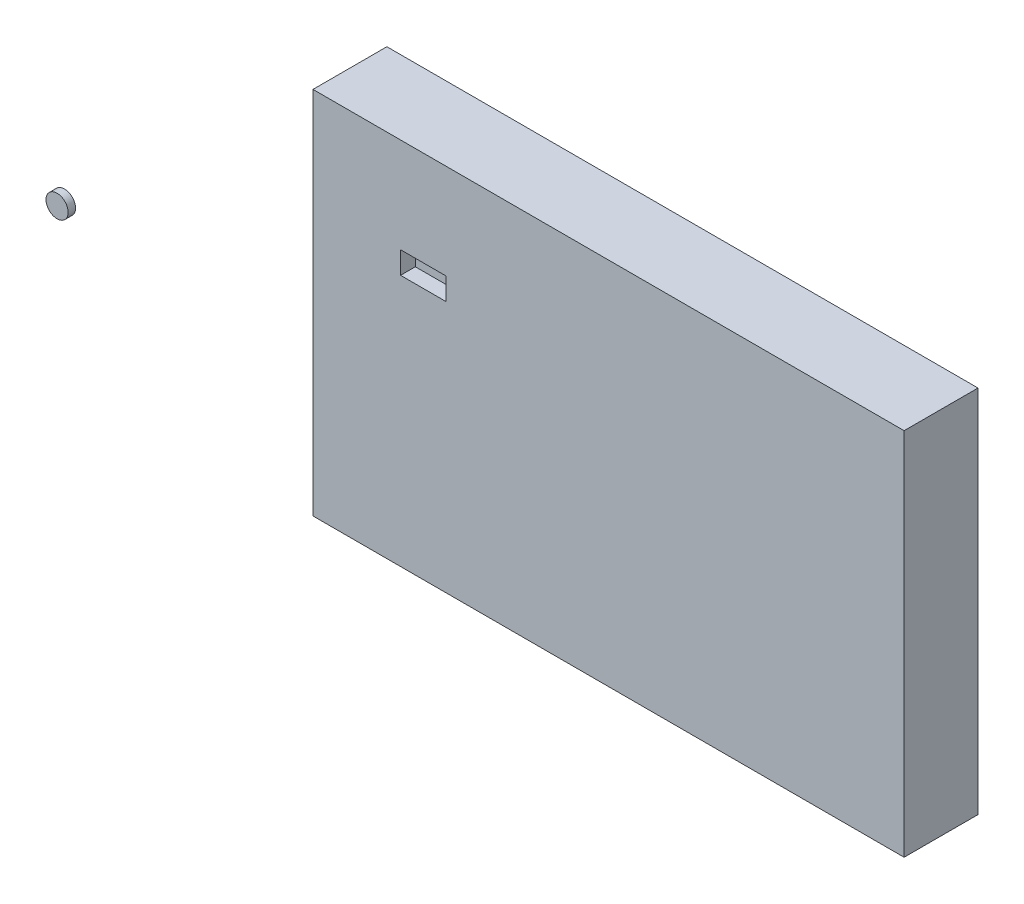
ISO-10303-21;
HEADER;
FILE_DESCRIPTION(('STEP AP214'),'2;1');
FILE_NAME('part.step','',(''),(''),'','','');
FILE_SCHEMA(('AUTOMOTIVE_DESIGN { 1 0 10303 214 1 1 1 1 }'));
ENDSEC;
DATA;
#1=APPLICATION_CONTEXT('core data for automotive mechanical design processes');
#2=APPLICATION_PROTOCOL_DEFINITION('international standard','automotive_design',2000,#1);
#3=PRODUCT_CONTEXT('',#1,'mechanical');
#4=PRODUCT('Part','Part','',(#3));
#5=PRODUCT_RELATED_PRODUCT_CATEGORY('part','',(#4));
#6=PRODUCT_DEFINITION_FORMATION('','',#4);
#7=PRODUCT_DEFINITION_CONTEXT('part definition',#1,'design');
#8=PRODUCT_DEFINITION('design','',#6,#7);
#9=PRODUCT_DEFINITION_SHAPE('','',#8);
#10=(LENGTH_UNIT() NAMED_UNIT(*) SI_UNIT(.MILLI.,.METRE.));
#11=(NAMED_UNIT(*) PLANE_ANGLE_UNIT() SI_UNIT($,.RADIAN.));
#12=(NAMED_UNIT(*) SI_UNIT($,.STERADIAN.) SOLID_ANGLE_UNIT());
#13=UNCERTAINTY_MEASURE_WITH_UNIT(LENGTH_MEASURE(1.E-05),#10,'distance_accuracy_value','');
#14=(GEOMETRIC_REPRESENTATION_CONTEXT(3) GLOBAL_UNCERTAINTY_ASSIGNED_CONTEXT((#13)) GLOBAL_UNIT_ASSIGNED_CONTEXT((#10,
#11,#12)) REPRESENTATION_CONTEXT('',''));
#15=CARTESIAN_POINT('',(0.,0.,0.));
#16=DIRECTION('',(0.,0.,1.));
#17=DIRECTION('',(1.,0.,0.));
#18=AXIS2_PLACEMENT_3D('',#15,#16,#17);
#19=CARTESIAN_POINT('',(-43.6335876793521,10.0140681583412,1.));
#20=DIRECTION('',(0.,0.,-1.));
#21=DIRECTION('',(-1.,0.,0.));
#22=AXIS2_PLACEMENT_3D('',#19,#20,#21);
#23=CYLINDRICAL_SURFACE('',#22,1.5);
#24=CARTESIAN_POINT('',(-43.6335876793521,10.0140681583412,1.));
#25=DIRECTION('',(0.,0.,1.));
#26=DIRECTION('',(1.,0.,0.));
#27=AXIS2_PLACEMENT_3D('',#24,#25,#26);
#28=CIRCLE('',#27,1.5);
#29=CARTESIAN_POINT('',(-42.1335876793521,10.0140681583412,1.));
#30=VERTEX_POINT('',#29);
#31=EDGE_CURVE('E11',#30,#30,#28,.T.);
#32=ORIENTED_EDGE('',*,*,#31,.F.);
#33=EDGE_LOOP('',(#32));
#34=FACE_BOUND('',#33,.T.);
#35=CARTESIAN_POINT('',(-43.6335876793521,10.0140681583412,0.));
#36=DIRECTION('',(0.,0.,1.));
#37=DIRECTION('',(1.,0.,0.));
#38=AXIS2_PLACEMENT_3D('',#35,#36,#37);
#39=CIRCLE('',#38,1.5);
#40=CARTESIAN_POINT('',(-42.1335876793521,10.0140681583412,0.));
#41=VERTEX_POINT('',#40);
#42=EDGE_CURVE('E45',#41,#41,#39,.T.);
#43=ORIENTED_EDGE('',*,*,#42,.T.);
#44=EDGE_LOOP('',(#43));
#45=FACE_BOUND('',#44,.T.);
#46=ADVANCED_FACE('F42',(#34,#45),#23,.T.);
#47=CARTESIAN_POINT('',(-43.6335876793521,10.0140681583412,1.));
#48=DIRECTION('',(0.,0.,1.));
#49=DIRECTION('',(1.,0.,0.));
#50=AXIS2_PLACEMENT_3D('',#47,#48,#49);
#51=PLANE('',#50);
#52=ORIENTED_EDGE('',*,*,#31,.T.);
#53=EDGE_LOOP('',(#52));
#54=FACE_BOUND('',#53,.T.);
#55=ADVANCED_FACE('F57',(#54),#51,.T.);
#56=CARTESIAN_POINT('',(-43.6335876793521,10.0140681583412,0.));
#57=DIRECTION('',(0.,0.,1.));
#58=DIRECTION('',(1.,0.,0.));
#59=AXIS2_PLACEMENT_3D('',#56,#57,#58);
#60=PLANE('',#59);
#61=ORIENTED_EDGE('',*,*,#42,.F.);
#62=EDGE_LOOP('',(#61));
#63=FACE_BOUND('',#62,.T.);
#64=ADVANCED_FACE('F55',(#63),#60,.F.);
#65=CLOSED_SHELL('',(#46,#55,#64));
#66=MANIFOLD_SOLID_BREP('B2_NOT_SHOWN',#65);
#67=CARTESIAN_POINT('',(0.,0.,10.));
#68=DIRECTION('',(1.,0.,0.));
#69=DIRECTION('',(0.,0.,-1.));
#70=AXIS2_PLACEMENT_3D('',#67,#68,#69);
#71=PLANE('',#70);
#72=DIRECTION('',(0.,-1.,0.));
#73=VECTOR('',#72,1.);
#74=CARTESIAN_POINT('',(0.,0.,0.));
#75=LINE('',#74,#73);
#76=CARTESIAN_POINT('',(0.,50.,0.));
#77=VERTEX_POINT('',#76);
#78=CARTESIAN_POINT('',(0.,0.,0.));
#79=VERTEX_POINT('',#78);
#80=EDGE_CURVE('E190',#77,#79,#75,.T.);
#81=ORIENTED_EDGE('',*,*,#80,.T.);
#82=DIRECTION('',(0.,0.,-1.));
#83=VECTOR('',#82,1.);
#84=CARTESIAN_POINT('',(0.,0.,10.));
#85=LINE('',#84,#83);
#86=CARTESIAN_POINT('',(0.,0.,10.));
#87=VERTEX_POINT('',#86);
#88=EDGE_CURVE('E40',#87,#79,#85,.T.);
#89=ORIENTED_EDGE('',*,*,#88,.F.);
#90=DIRECTION('',(0.,-1.,0.));
#91=VECTOR('',#90,1.);
#92=CARTESIAN_POINT('',(0.,0.,10.));
#93=LINE('',#92,#91);
#94=CARTESIAN_POINT('',(0.,50.,10.));
#95=VERTEX_POINT('',#94);
#96=EDGE_CURVE('E194',#95,#87,#93,.T.);
#97=ORIENTED_EDGE('',*,*,#96,.F.);
#98=DIRECTION('',(0.,0.,-1.));
#99=VECTOR('',#98,1.);
#100=CARTESIAN_POINT('',(0.,50.,10.));
#101=LINE('',#100,#99);
#102=EDGE_CURVE('E200',#95,#77,#101,.T.);
#103=ORIENTED_EDGE('',*,*,#102,.T.);
#104=EDGE_LOOP('',(#81,#89,#97,#103));
#105=FACE_BOUND('',#104,.T.);
#106=ADVANCED_FACE('F82',(#105),#71,.F.);
#107=CARTESIAN_POINT('',(0.,0.,10.));
#108=DIRECTION('',(0.,1.,0.));
#109=DIRECTION('',(0.,0.,1.));
#110=AXIS2_PLACEMENT_3D('',#107,#108,#109);
#111=PLANE('',#110);
#112=DIRECTION('',(1.,0.,0.));
#113=VECTOR('',#112,1.);
#114=CARTESIAN_POINT('',(0.,0.,0.));
#115=LINE('',#114,#113);
#116=CARTESIAN_POINT('',(80.,0.,0.));
#117=VERTEX_POINT('',#116);
#118=EDGE_CURVE('E203',#79,#117,#115,.T.);
#119=ORIENTED_EDGE('',*,*,#118,.T.);
#120=DIRECTION('',(0.,0.,-1.));
#121=VECTOR('',#120,1.);
#122=CARTESIAN_POINT('',(80.,0.,10.));
#123=LINE('',#122,#121);
#124=CARTESIAN_POINT('',(80.,0.,10.));
#125=VERTEX_POINT('',#124);
#126=EDGE_CURVE('E89',#125,#117,#123,.T.);
#127=ORIENTED_EDGE('',*,*,#126,.F.);
#128=DIRECTION('',(1.,0.,0.));
#129=VECTOR('',#128,1.);
#130=CARTESIAN_POINT('',(0.,0.,10.));
#131=LINE('',#130,#129);
#132=EDGE_CURVE('E133',#87,#125,#131,.T.);
#133=ORIENTED_EDGE('',*,*,#132,.F.);
#134=ORIENTED_EDGE('',*,*,#88,.T.);
#135=EDGE_LOOP('',(#119,#127,#133,#134));
#136=FACE_BOUND('',#135,.T.);
#137=ADVANCED_FACE('F232',(#136),#111,.F.);
#138=CARTESIAN_POINT('',(80.,0.,10.));
#139=DIRECTION('',(-1.,0.,0.));
#140=DIRECTION('',(0.,0.,1.));
#141=AXIS2_PLACEMENT_3D('',#138,#139,#140);
#142=PLANE('',#141);
#143=DIRECTION('',(0.,1.,0.));
#144=VECTOR('',#143,1.);
#145=CARTESIAN_POINT('',(80.,0.,0.));
#146=LINE('',#145,#144);
#147=CARTESIAN_POINT('',(80.,50.,0.));
#148=VERTEX_POINT('',#147);
#149=EDGE_CURVE('E205',#117,#148,#146,.T.);
#150=ORIENTED_EDGE('',*,*,#149,.T.);
#151=DIRECTION('',(0.,0.,-1.));
#152=VECTOR('',#151,1.);
#153=CARTESIAN_POINT('',(80.,50.,10.));
#154=LINE('',#153,#152);
#155=CARTESIAN_POINT('',(80.,50.,10.));
#156=VERTEX_POINT('',#155);
#157=EDGE_CURVE('E209',#156,#148,#154,.T.);
#158=ORIENTED_EDGE('',*,*,#157,.F.);
#159=DIRECTION('',(0.,1.,0.));
#160=VECTOR('',#159,1.);
#161=CARTESIAN_POINT('',(80.,0.,10.));
#162=LINE('',#161,#160);
#163=EDGE_CURVE('E197',#125,#156,#162,.T.);
#164=ORIENTED_EDGE('',*,*,#163,.F.);
#165=ORIENTED_EDGE('',*,*,#126,.T.);
#166=EDGE_LOOP('',(#150,#158,#164,#165));
#167=FACE_BOUND('',#166,.T.);
#168=ADVANCED_FACE('F214',(#167),#142,.F.);
#169=CARTESIAN_POINT('',(0.,50.,10.));
#170=DIRECTION('',(0.,-1.,0.));
#171=DIRECTION('',(0.,0.,-1.));
#172=AXIS2_PLACEMENT_3D('',#169,#170,#171);
#173=PLANE('',#172);
#174=DIRECTION('',(-1.,0.,0.));
#175=VECTOR('',#174,1.);
#176=CARTESIAN_POINT('',(0.,50.,0.));
#177=LINE('',#176,#175);
#178=EDGE_CURVE('E126',#148,#77,#177,.T.);
#179=ORIENTED_EDGE('',*,*,#178,.T.);
#180=ORIENTED_EDGE('',*,*,#102,.F.);
#181=DIRECTION('',(-1.,0.,0.));
#182=VECTOR('',#181,1.);
#183=CARTESIAN_POINT('',(0.,50.,10.));
#184=LINE('',#183,#182);
#185=EDGE_CURVE('E105',#156,#95,#184,.T.);
#186=ORIENTED_EDGE('',*,*,#185,.F.);
#187=ORIENTED_EDGE('',*,*,#157,.T.);
#188=EDGE_LOOP('',(#179,#180,#186,#187));
#189=FACE_BOUND('',#188,.T.);
#190=ADVANCED_FACE('F222',(#189),#173,.F.);
#191=CARTESIAN_POINT('',(0.,50.,10.));
#192=DIRECTION('',(0.,0.,-1.));
#193=DIRECTION('',(-1.,0.,0.));
#194=AXIS2_PLACEMENT_3D('',#191,#192,#193);
#195=PLANE('',#194);
#196=DIRECTION('',(1.,0.,0.));
#197=VECTOR('',#196,1.);
#198=CARTESIAN_POINT('',(11.851754982473,34.1340366019267,10.));
#199=LINE('',#198,#197);
#200=CARTESIAN_POINT('',(11.851754982473,34.1340366019267,10.));
#201=VERTEX_POINT('',#200);
#202=CARTESIAN_POINT('',(18.0091075021664,34.1340366019267,10.));
#203=VERTEX_POINT('',#202);
#204=EDGE_CURVE('E184',#201,#203,#199,.T.);
#205=ORIENTED_EDGE('',*,*,#204,.F.);
#206=DIRECTION('',(0.,-1.,0.));
#207=VECTOR('',#206,1.);
#208=CARTESIAN_POINT('',(11.851754982473,37.1340366019267,10.));
#209=LINE('',#208,#207);
#210=CARTESIAN_POINT('',(11.851754982473,37.1340366019267,10.));
#211=VERTEX_POINT('',#210);
#212=EDGE_CURVE('E96',#211,#201,#209,.T.);
#213=ORIENTED_EDGE('',*,*,#212,.F.);
#214=DIRECTION('',(-1.,0.,0.));
#215=VECTOR('',#214,1.);
#216=CARTESIAN_POINT('',(11.851754982473,37.1340366019267,10.));
#217=LINE('',#216,#215);
#218=CARTESIAN_POINT('',(18.0091075021664,37.1340366019267,10.));
#219=VERTEX_POINT('',#218);
#220=EDGE_CURVE('E175',#219,#211,#217,.T.);
#221=ORIENTED_EDGE('',*,*,#220,.F.);
#222=DIRECTION('',(0.,1.,0.));
#223=VECTOR('',#222,1.);
#224=CARTESIAN_POINT('',(18.0091075021664,37.1340366019267,10.));
#225=LINE('',#224,#223);
#226=EDGE_CURVE('E178',#203,#219,#225,.T.);
#227=ORIENTED_EDGE('',*,*,#226,.F.);
#228=EDGE_LOOP('',(#205,#213,#221,#227));
#229=FACE_BOUND('',#228,.T.);
#230=ORIENTED_EDGE('',*,*,#96,.T.);
#231=ORIENTED_EDGE('',*,*,#132,.T.);
#232=ORIENTED_EDGE('',*,*,#163,.T.);
#233=ORIENTED_EDGE('',*,*,#185,.T.);
#234=EDGE_LOOP('',(#230,#231,#232,#233));
#235=FACE_BOUND('',#234,.T.);
#236=ADVANCED_FACE('F224',(#229,#235),#195,.F.);
#237=CARTESIAN_POINT('',(0.,50.,0.));
#238=DIRECTION('',(0.,0.,-1.));
#239=DIRECTION('',(-1.,0.,0.));
#240=AXIS2_PLACEMENT_3D('',#237,#238,#239);
#241=PLANE('',#240);
#242=ORIENTED_EDGE('',*,*,#80,.F.);
#243=ORIENTED_EDGE('',*,*,#178,.F.);
#244=ORIENTED_EDGE('',*,*,#149,.F.);
#245=ORIENTED_EDGE('',*,*,#118,.F.);
#246=EDGE_LOOP('',(#242,#243,#244,#245));
#247=FACE_BOUND('',#246,.T.);
#248=ADVANCED_FACE('F218',(#247),#241,.T.);
#249=CARTESIAN_POINT('',(11.851754982473,37.1340366019267,8.));
#250=DIRECTION('',(-1.,0.,0.));
#251=DIRECTION('',(0.,0.,1.));
#252=AXIS2_PLACEMENT_3D('',#249,#250,#251);
#253=PLANE('',#252);
#254=ORIENTED_EDGE('',*,*,#212,.T.);
#255=DIRECTION('',(0.,0.,1.));
#256=VECTOR('',#255,1.);
#257=CARTESIAN_POINT('',(11.851754982473,34.1340366019267,8.));
#258=LINE('',#257,#256);
#259=CARTESIAN_POINT('',(11.851754982473,34.1340366019267,8.));
#260=VERTEX_POINT('',#259);
#261=EDGE_CURVE('E153',#260,#201,#258,.T.);
#262=ORIENTED_EDGE('',*,*,#261,.F.);
#263=DIRECTION('',(0.,-1.,0.));
#264=VECTOR('',#263,1.);
#265=CARTESIAN_POINT('',(11.851754982473,37.1340366019267,8.));
#266=LINE('',#265,#264);
#267=CARTESIAN_POINT('',(11.851754982473,37.1340366019267,8.));
#268=VERTEX_POINT('',#267);
#269=EDGE_CURVE('E157',#268,#260,#266,.T.);
#270=ORIENTED_EDGE('',*,*,#269,.F.);
#271=DIRECTION('',(0.,0.,1.));
#272=VECTOR('',#271,1.);
#273=CARTESIAN_POINT('',(11.851754982473,37.1340366019267,8.));
#274=LINE('',#273,#272);
#275=EDGE_CURVE('E188',#268,#211,#274,.T.);
#276=ORIENTED_EDGE('',*,*,#275,.T.);
#277=EDGE_LOOP('',(#254,#262,#270,#276));
#278=FACE_BOUND('',#277,.T.);
#279=ADVANCED_FACE('F155',(#278),#253,.F.);
#280=CARTESIAN_POINT('',(11.851754982473,37.1340366019267,8.));
#281=DIRECTION('',(0.,1.,0.));
#282=DIRECTION('',(0.,0.,1.));
#283=AXIS2_PLACEMENT_3D('',#280,#281,#282);
#284=PLANE('',#283);
#285=ORIENTED_EDGE('',*,*,#220,.T.);
#286=ORIENTED_EDGE('',*,*,#275,.F.);
#287=DIRECTION('',(-1.,0.,0.));
#288=VECTOR('',#287,1.);
#289=CARTESIAN_POINT('',(11.851754982473,37.1340366019267,8.));
#290=LINE('',#289,#288);
#291=CARTESIAN_POINT('',(18.0091075021664,37.1340366019267,8.));
#292=VERTEX_POINT('',#291);
#293=EDGE_CURVE('E163',#292,#268,#290,.T.);
#294=ORIENTED_EDGE('',*,*,#293,.F.);
#295=DIRECTION('',(0.,0.,1.));
#296=VECTOR('',#295,1.);
#297=CARTESIAN_POINT('',(18.0091075021664,37.1340366019267,8.));
#298=LINE('',#297,#296);
#299=EDGE_CURVE('E191',#292,#219,#298,.T.);
#300=ORIENTED_EDGE('',*,*,#299,.T.);
#301=EDGE_LOOP('',(#285,#286,#294,#300));
#302=FACE_BOUND('',#301,.T.);
#303=ADVANCED_FACE('F271',(#302),#284,.F.);
#304=CARTESIAN_POINT('',(18.0091075021664,37.1340366019267,8.));
#305=DIRECTION('',(1.,0.,0.));
#306=DIRECTION('',(0.,0.,-1.));
#307=AXIS2_PLACEMENT_3D('',#304,#305,#306);
#308=PLANE('',#307);
#309=ORIENTED_EDGE('',*,*,#226,.T.);
#310=ORIENTED_EDGE('',*,*,#299,.F.);
#311=DIRECTION('',(0.,1.,0.));
#312=VECTOR('',#311,1.);
#313=CARTESIAN_POINT('',(18.0091075021664,37.1340366019267,8.));
#314=LINE('',#313,#312);
#315=CARTESIAN_POINT('',(18.0091075021664,34.1340366019267,8.));
#316=VERTEX_POINT('',#315);
#317=EDGE_CURVE('E171',#316,#292,#314,.T.);
#318=ORIENTED_EDGE('',*,*,#317,.F.);
#319=DIRECTION('',(0.,0.,1.));
#320=VECTOR('',#319,1.);
#321=CARTESIAN_POINT('',(18.0091075021664,34.1340366019267,8.));
#322=LINE('',#321,#320);
#323=EDGE_CURVE('E162',#316,#203,#322,.T.);
#324=ORIENTED_EDGE('',*,*,#323,.T.);
#325=EDGE_LOOP('',(#309,#310,#318,#324));
#326=FACE_BOUND('',#325,.T.);
#327=ADVANCED_FACE('F280',(#326),#308,.F.);
#328=CARTESIAN_POINT('',(11.851754982473,34.1340366019267,8.));
#329=DIRECTION('',(0.,-1.,0.));
#330=DIRECTION('',(0.,0.,-1.));
#331=AXIS2_PLACEMENT_3D('',#328,#329,#330);
#332=PLANE('',#331);
#333=ORIENTED_EDGE('',*,*,#204,.T.);
#334=ORIENTED_EDGE('',*,*,#323,.F.);
#335=DIRECTION('',(1.,0.,0.));
#336=VECTOR('',#335,1.);
#337=CARTESIAN_POINT('',(11.851754982473,34.1340366019267,8.));
#338=LINE('',#337,#336);
#339=EDGE_CURVE('E166',#260,#316,#338,.T.);
#340=ORIENTED_EDGE('',*,*,#339,.F.);
#341=ORIENTED_EDGE('',*,*,#261,.T.);
#342=EDGE_LOOP('',(#333,#334,#340,#341));
#343=FACE_BOUND('',#342,.T.);
#344=ADVANCED_FACE('F167',(#343),#332,.F.);
#345=CARTESIAN_POINT('',(11.851754982473,34.1340366019267,8.));
#346=DIRECTION('',(0.,0.,1.));
#347=DIRECTION('',(1.,0.,0.));
#348=AXIS2_PLACEMENT_3D('',#345,#346,#347);
#349=PLANE('',#348);
#350=ORIENTED_EDGE('',*,*,#269,.T.);
#351=ORIENTED_EDGE('',*,*,#339,.T.);
#352=ORIENTED_EDGE('',*,*,#317,.T.);
#353=ORIENTED_EDGE('',*,*,#293,.T.);
#354=EDGE_LOOP('',(#350,#351,#352,#353));
#355=FACE_BOUND('',#354,.T.);
#356=ADVANCED_FACE('F173',(#355),#349,.T.);
#357=CLOSED_SHELL('',(#106,#137,#168,#190,#236,#248,#279,#303,#327,#344,#356));
#358=MANIFOLD_SOLID_BREP('B6',#357);
#359=ADVANCED_BREP_SHAPE_REPRESENTATION('',(#18,#66,#358),#14);
#360=SHAPE_DEFINITION_REPRESENTATION(#9,#359);
ENDSEC;
END-ISO-10303-21;
